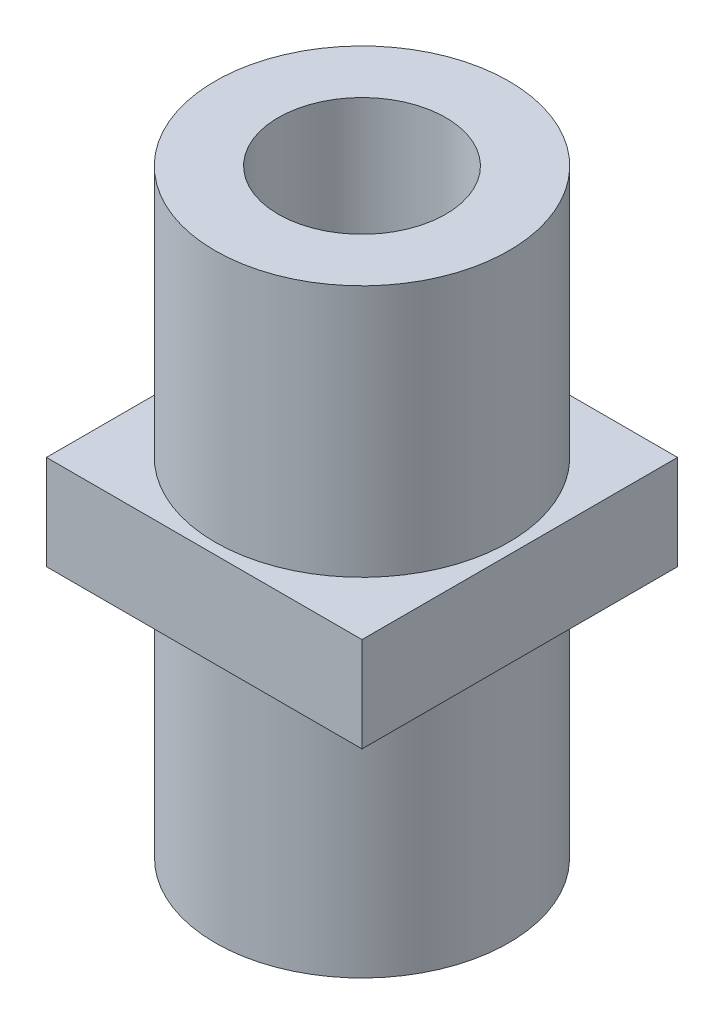
ISO-10303-21;
HEADER;
FILE_DESCRIPTION(('STEP AP214'),'2;1');
FILE_NAME('part.step','',(''),(''),'','','');
FILE_SCHEMA(('AUTOMOTIVE_DESIGN { 1 0 10303 214 1 1 1 1 }'));
ENDSEC;
DATA;
#1=APPLICATION_CONTEXT('core data for automotive mechanical design processes');
#2=APPLICATION_PROTOCOL_DEFINITION('international standard','automotive_design',2000,#1);
#3=PRODUCT_CONTEXT('',#1,'mechanical');
#4=PRODUCT('Part','Part','',(#3));
#5=PRODUCT_RELATED_PRODUCT_CATEGORY('part','',(#4));
#6=PRODUCT_DEFINITION_FORMATION('','',#4);
#7=PRODUCT_DEFINITION_CONTEXT('part definition',#1,'design');
#8=PRODUCT_DEFINITION('design','',#6,#7);
#9=PRODUCT_DEFINITION_SHAPE('','',#8);
#10=(LENGTH_UNIT() NAMED_UNIT(*) SI_UNIT(.MILLI.,.METRE.));
#11=(NAMED_UNIT(*) PLANE_ANGLE_UNIT() SI_UNIT($,.RADIAN.));
#12=(NAMED_UNIT(*) SI_UNIT($,.STERADIAN.) SOLID_ANGLE_UNIT());
#13=UNCERTAINTY_MEASURE_WITH_UNIT(LENGTH_MEASURE(1.E-05),#10,'distance_accuracy_value','');
#14=(GEOMETRIC_REPRESENTATION_CONTEXT(3) GLOBAL_UNCERTAINTY_ASSIGNED_CONTEXT((#13)) GLOBAL_UNIT_ASSIGNED_CONTEXT((#10,
#11,#12)) REPRESENTATION_CONTEXT('',''));
#15=CARTESIAN_POINT('',(0.,0.,0.));
#16=DIRECTION('',(0.,0.,1.));
#17=DIRECTION('',(1.,0.,0.));
#18=AXIS2_PLACEMENT_3D('',#15,#16,#17);
#19=CARTESIAN_POINT('',(0.,8.,0.));
#20=DIRECTION('',(0.,-1.,0.));
#21=DIRECTION('',(0.,0.,-1.));
#22=AXIS2_PLACEMENT_3D('',#19,#20,#21);
#23=CYLINDRICAL_SURFACE('',#22,4.65);
#24=CARTESIAN_POINT('',(0.,8.,0.));
#25=DIRECTION('',(0.,1.,0.));
#26=DIRECTION('',(0.,0.,1.));
#27=AXIS2_PLACEMENT_3D('',#24,#25,#26);
#28=CIRCLE('',#27,4.65);
#29=CARTESIAN_POINT('',(0.,8.,4.65));
#30=VERTEX_POINT('',#29);
#31=EDGE_CURVE('E53',#30,#30,#28,.T.);
#32=ORIENTED_EDGE('',*,*,#31,.F.);
#33=EDGE_LOOP('',(#32));
#34=FACE_BOUND('',#33,.T.);
#35=CARTESIAN_POINT('',(0.,0.,0.));
#36=DIRECTION('',(0.,1.,0.));
#37=DIRECTION('',(0.,0.,1.));
#38=AXIS2_PLACEMENT_3D('',#35,#36,#37);
#39=CIRCLE('',#38,4.65);
#40=CARTESIAN_POINT('',(0.,0.,4.65));
#41=VERTEX_POINT('',#40);
#42=EDGE_CURVE('E134',#41,#41,#39,.T.);
#43=ORIENTED_EDGE('',*,*,#42,.T.);
#44=EDGE_LOOP('',(#43));
#45=FACE_BOUND('',#44,.T.);
#46=ADVANCED_FACE('F43',(#34,#45),#23,.T.);
#47=CARTESIAN_POINT('',(0.,0.,0.));
#48=DIRECTION('',(0.,1.,0.));
#49=DIRECTION('',(0.,0.,1.));
#50=AXIS2_PLACEMENT_3D('',#47,#48,#49);
#51=PLANE('',#50);
#52=CARTESIAN_POINT('',(0.,0.,0.));
#53=DIRECTION('',(0.,1.,0.));
#54=DIRECTION('',(0.,0.,1.));
#55=AXIS2_PLACEMENT_3D('',#52,#53,#54);
#56=CIRCLE('',#55,2.655);
#57=CARTESIAN_POINT('',(0.,0.,2.655));
#58=VERTEX_POINT('',#57);
#59=EDGE_CURVE('E188',#58,#58,#56,.T.);
#60=ORIENTED_EDGE('',*,*,#59,.T.);
#61=EDGE_LOOP('',(#60));
#62=FACE_BOUND('',#61,.T.);
#63=ORIENTED_EDGE('',*,*,#42,.F.);
#64=EDGE_LOOP('',(#63));
#65=FACE_BOUND('',#64,.T.);
#66=ADVANCED_FACE('F142',(#62,#65),#51,.F.);
#67=CARTESIAN_POINT('',(5.,11.,-5.));
#68=DIRECTION('',(-1.,0.,0.));
#69=DIRECTION('',(0.,0.,1.));
#70=AXIS2_PLACEMENT_3D('',#67,#68,#69);
#71=PLANE('',#70);
#72=DIRECTION('',(0.,0.,-1.));
#73=VECTOR('',#72,1.);
#74=CARTESIAN_POINT('',(5.,8.,-5.));
#75=LINE('',#74,#73);
#76=CARTESIAN_POINT('',(5.,8.,5.));
#77=VERTEX_POINT('',#76);
#78=CARTESIAN_POINT('',(5.,8.,-5.));
#79=VERTEX_POINT('',#78);
#80=EDGE_CURVE('E117',#77,#79,#75,.T.);
#81=ORIENTED_EDGE('',*,*,#80,.T.);
#82=DIRECTION('',(0.,-1.,0.));
#83=VECTOR('',#82,1.);
#84=CARTESIAN_POINT('',(5.,11.,-5.));
#85=LINE('',#84,#83);
#86=CARTESIAN_POINT('',(5.,11.,-5.));
#87=VERTEX_POINT('',#86);
#88=EDGE_CURVE('E106',#87,#79,#85,.T.);
#89=ORIENTED_EDGE('',*,*,#88,.F.);
#90=DIRECTION('',(0.,0.,-1.));
#91=VECTOR('',#90,1.);
#92=CARTESIAN_POINT('',(5.,11.,-5.));
#93=LINE('',#92,#91);
#94=CARTESIAN_POINT('',(5.,11.,5.));
#95=VERTEX_POINT('',#94);
#96=EDGE_CURVE('E98',#95,#87,#93,.T.);
#97=ORIENTED_EDGE('',*,*,#96,.F.);
#98=DIRECTION('',(0.,-1.,0.));
#99=VECTOR('',#98,1.);
#100=CARTESIAN_POINT('',(5.,11.,5.));
#101=LINE('',#100,#99);
#102=EDGE_CURVE('E113',#95,#77,#101,.T.);
#103=ORIENTED_EDGE('',*,*,#102,.T.);
#104=EDGE_LOOP('',(#81,#89,#97,#103));
#105=FACE_BOUND('',#104,.T.);
#106=ADVANCED_FACE('F144',(#105),#71,.F.);
#107=CARTESIAN_POINT('',(-5.,11.,-5.));
#108=DIRECTION('',(0.,0.,1.));
#109=DIRECTION('',(1.,0.,0.));
#110=AXIS2_PLACEMENT_3D('',#107,#108,#109);
#111=PLANE('',#110);
#112=DIRECTION('',(-1.,0.,0.));
#113=VECTOR('',#112,1.);
#114=CARTESIAN_POINT('',(-5.,8.,-5.));
#115=LINE('',#114,#113);
#116=CARTESIAN_POINT('',(-5.,8.,-5.));
#117=VERTEX_POINT('',#116);
#118=EDGE_CURVE('E104',#79,#117,#115,.T.);
#119=ORIENTED_EDGE('',*,*,#118,.T.);
#120=DIRECTION('',(0.,-1.,0.));
#121=VECTOR('',#120,1.);
#122=CARTESIAN_POINT('',(-5.,11.,-5.));
#123=LINE('',#122,#121);
#124=CARTESIAN_POINT('',(-5.,11.,-5.));
#125=VERTEX_POINT('',#124);
#126=EDGE_CURVE('E102',#125,#117,#123,.T.);
#127=ORIENTED_EDGE('',*,*,#126,.F.);
#128=DIRECTION('',(-1.,0.,0.));
#129=VECTOR('',#128,1.);
#130=CARTESIAN_POINT('',(-5.,11.,-5.));
#131=LINE('',#130,#129);
#132=EDGE_CURVE('E93',#87,#125,#131,.T.);
#133=ORIENTED_EDGE('',*,*,#132,.F.);
#134=ORIENTED_EDGE('',*,*,#88,.T.);
#135=EDGE_LOOP('',(#119,#127,#133,#134));
#136=FACE_BOUND('',#135,.T.);
#137=ADVANCED_FACE('F103',(#136),#111,.F.);
#138=CARTESIAN_POINT('',(-5.,11.,-5.));
#139=DIRECTION('',(1.,0.,0.));
#140=DIRECTION('',(0.,0.,-1.));
#141=AXIS2_PLACEMENT_3D('',#138,#139,#140);
#142=PLANE('',#141);
#143=DIRECTION('',(0.,0.,1.));
#144=VECTOR('',#143,1.);
#145=CARTESIAN_POINT('',(-5.,8.,-5.));
#146=LINE('',#145,#144);
#147=CARTESIAN_POINT('',(-5.,8.,5.));
#148=VERTEX_POINT('',#147);
#149=EDGE_CURVE('E79',#117,#148,#146,.T.);
#150=ORIENTED_EDGE('',*,*,#149,.T.);
#151=DIRECTION('',(0.,-1.,0.));
#152=VECTOR('',#151,1.);
#153=CARTESIAN_POINT('',(-5.,11.,5.));
#154=LINE('',#153,#152);
#155=CARTESIAN_POINT('',(-5.,11.,5.));
#156=VERTEX_POINT('',#155);
#157=EDGE_CURVE('E107',#156,#148,#154,.T.);
#158=ORIENTED_EDGE('',*,*,#157,.F.);
#159=DIRECTION('',(0.,0.,1.));
#160=VECTOR('',#159,1.);
#161=CARTESIAN_POINT('',(-5.,11.,-5.));
#162=LINE('',#161,#160);
#163=EDGE_CURVE('E96',#125,#156,#162,.T.);
#164=ORIENTED_EDGE('',*,*,#163,.F.);
#165=ORIENTED_EDGE('',*,*,#126,.T.);
#166=EDGE_LOOP('',(#150,#158,#164,#165));
#167=FACE_BOUND('',#166,.T.);
#168=ADVANCED_FACE('F109',(#167),#142,.F.);
#169=CARTESIAN_POINT('',(-5.,11.,5.));
#170=DIRECTION('',(0.,0.,-1.));
#171=DIRECTION('',(-1.,0.,0.));
#172=AXIS2_PLACEMENT_3D('',#169,#170,#171);
#173=PLANE('',#172);
#174=DIRECTION('',(1.,0.,0.));
#175=VECTOR('',#174,1.);
#176=CARTESIAN_POINT('',(-5.,8.,5.));
#177=LINE('',#176,#175);
#178=EDGE_CURVE('E85',#148,#77,#177,.T.);
#179=ORIENTED_EDGE('',*,*,#178,.T.);
#180=ORIENTED_EDGE('',*,*,#102,.F.);
#181=DIRECTION('',(1.,0.,0.));
#182=VECTOR('',#181,1.);
#183=CARTESIAN_POINT('',(-5.,11.,5.));
#184=LINE('',#183,#182);
#185=EDGE_CURVE('E62',#156,#95,#184,.T.);
#186=ORIENTED_EDGE('',*,*,#185,.F.);
#187=ORIENTED_EDGE('',*,*,#157,.T.);
#188=EDGE_LOOP('',(#179,#180,#186,#187));
#189=FACE_BOUND('',#188,.T.);
#190=ADVANCED_FACE('F161',(#189),#173,.F.);
#191=CARTESIAN_POINT('',(0.,11.,0.));
#192=DIRECTION('',(0.,1.,0.));
#193=DIRECTION('',(0.,0.,1.));
#194=AXIS2_PLACEMENT_3D('',#191,#192,#193);
#195=PLANE('',#194);
#196=CARTESIAN_POINT('',(0.,11.,0.));
#197=DIRECTION('',(0.,1.,0.));
#198=DIRECTION('',(0.,0.,1.));
#199=AXIS2_PLACEMENT_3D('',#196,#197,#198);
#200=CIRCLE('',#199,4.655);
#201=CARTESIAN_POINT('',(0.,11.,4.655));
#202=VERTEX_POINT('',#201);
#203=EDGE_CURVE('E11',#202,#202,#200,.T.);
#204=ORIENTED_EDGE('',*,*,#203,.F.);
#205=EDGE_LOOP('',(#204));
#206=FACE_BOUND('',#205,.T.);
#207=ORIENTED_EDGE('',*,*,#96,.T.);
#208=ORIENTED_EDGE('',*,*,#132,.T.);
#209=ORIENTED_EDGE('',*,*,#163,.T.);
#210=ORIENTED_EDGE('',*,*,#185,.T.);
#211=EDGE_LOOP('',(#207,#208,#209,#210));
#212=FACE_BOUND('',#211,.T.);
#213=ADVANCED_FACE('F94',(#206,#212),#195,.T.);
#214=CARTESIAN_POINT('',(0.,8.,0.));
#215=DIRECTION('',(0.,1.,0.));
#216=DIRECTION('',(0.,0.,1.));
#217=AXIS2_PLACEMENT_3D('',#214,#215,#216);
#218=PLANE('',#217);
#219=ORIENTED_EDGE('',*,*,#31,.T.);
#220=EDGE_LOOP('',(#219));
#221=FACE_BOUND('',#220,.T.);
#222=ORIENTED_EDGE('',*,*,#80,.F.);
#223=ORIENTED_EDGE('',*,*,#178,.F.);
#224=ORIENTED_EDGE('',*,*,#149,.F.);
#225=ORIENTED_EDGE('',*,*,#118,.F.);
#226=EDGE_LOOP('',(#222,#223,#224,#225));
#227=FACE_BOUND('',#226,.T.);
#228=ADVANCED_FACE('F164',(#221,#227),#218,.F.);
#229=CARTESIAN_POINT('',(0.,19.,0.));
#230=DIRECTION('',(0.,-1.,0.));
#231=DIRECTION('',(0.,0.,-1.));
#232=AXIS2_PLACEMENT_3D('',#229,#230,#231);
#233=CYLINDRICAL_SURFACE('',#232,4.655);
#234=CARTESIAN_POINT('',(0.,19.,0.));
#235=DIRECTION('',(0.,1.,0.));
#236=DIRECTION('',(0.,0.,1.));
#237=AXIS2_PLACEMENT_3D('',#234,#235,#236);
#238=CIRCLE('',#237,4.655);
#239=CARTESIAN_POINT('',(0.,19.,4.655));
#240=VERTEX_POINT('',#239);
#241=EDGE_CURVE('E121',#240,#240,#238,.T.);
#242=ORIENTED_EDGE('',*,*,#241,.F.);
#243=EDGE_LOOP('',(#242));
#244=FACE_BOUND('',#243,.T.);
#245=ORIENTED_EDGE('',*,*,#203,.T.);
#246=EDGE_LOOP('',(#245));
#247=FACE_BOUND('',#246,.T.);
#248=ADVANCED_FACE('F167',(#244,#247),#233,.T.);
#249=CARTESIAN_POINT('',(0.,19.,0.));
#250=DIRECTION('',(0.,1.,0.));
#251=DIRECTION('',(0.,0.,1.));
#252=AXIS2_PLACEMENT_3D('',#249,#250,#251);
#253=PLANE('',#252);
#254=CARTESIAN_POINT('',(0.,19.,0.));
#255=DIRECTION('',(0.,1.,0.));
#256=DIRECTION('',(0.,0.,1.));
#257=AXIS2_PLACEMENT_3D('',#254,#255,#256);
#258=CIRCLE('',#257,2.655);
#259=CARTESIAN_POINT('',(0.,19.,2.655));
#260=VERTEX_POINT('',#259);
#261=EDGE_CURVE('E46',#260,#260,#258,.T.);
#262=ORIENTED_EDGE('',*,*,#261,.F.);
#263=EDGE_LOOP('',(#262));
#264=FACE_BOUND('',#263,.T.);
#265=ORIENTED_EDGE('',*,*,#241,.T.);
#266=EDGE_LOOP('',(#265));
#267=FACE_BOUND('',#266,.T.);
#268=ADVANCED_FACE('F174',(#264,#267),#253,.T.);
#269=CARTESIAN_POINT('',(0.,0.,0.));
#270=DIRECTION('',(0.,1.,0.));
#271=DIRECTION('',(0.,0.,1.));
#272=AXIS2_PLACEMENT_3D('',#269,#270,#271);
#273=CYLINDRICAL_SURFACE('',#272,2.655);
#274=ORIENTED_EDGE('',*,*,#261,.T.);
#275=EDGE_LOOP('',(#274));
#276=FACE_BOUND('',#275,.T.);
#277=ORIENTED_EDGE('',*,*,#59,.F.);
#278=EDGE_LOOP('',(#277));
#279=FACE_BOUND('',#278,.T.);
#280=ADVANCED_FACE('F177',(#276,#279),#273,.F.);
#281=CLOSED_SHELL('',(#46,#66,#106,#137,#168,#190,#213,#228,#248,#268,#280));
#282=MANIFOLD_SOLID_BREP('B2',#281);
#283=ADVANCED_BREP_SHAPE_REPRESENTATION('',(#18,#282),#14);
#284=SHAPE_DEFINITION_REPRESENTATION(#9,#283);
ENDSEC;
END-ISO-10303-21;
